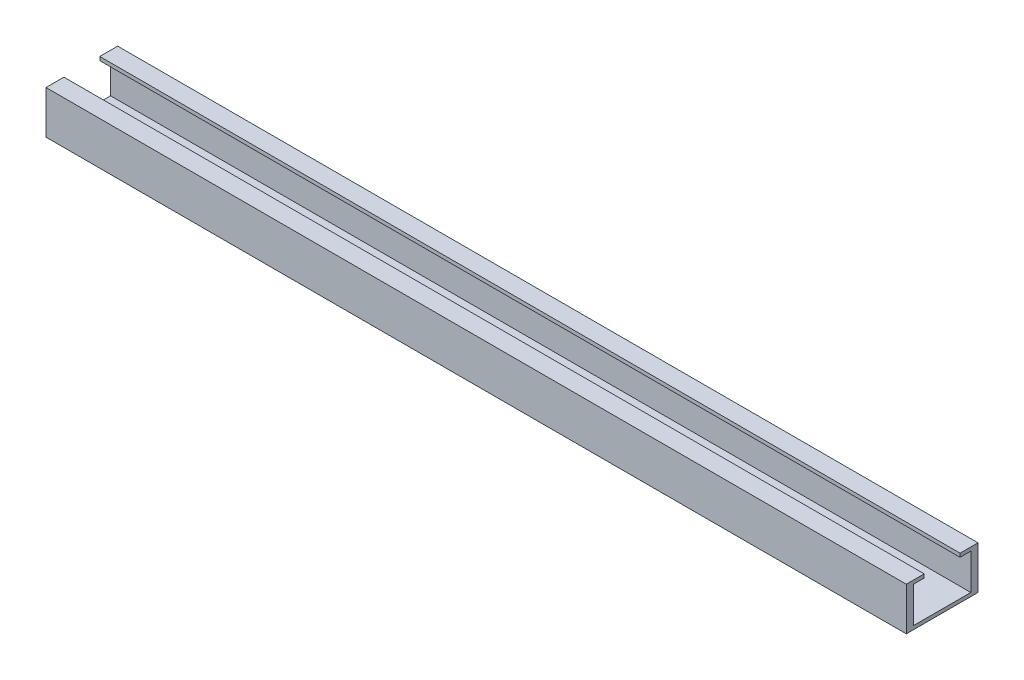
ISO-10303-21;
HEADER;
FILE_DESCRIPTION(('STEP AP214'),'2;1');
FILE_NAME('part.step','',(''),(''),'','','');
FILE_SCHEMA(('AUTOMOTIVE_DESIGN { 1 0 10303 214 1 1 1 1 }'));
ENDSEC;
DATA;
#1=APPLICATION_CONTEXT('core data for automotive mechanical design processes');
#2=APPLICATION_PROTOCOL_DEFINITION('international standard','automotive_design',2000,#1);
#3=PRODUCT_CONTEXT('',#1,'mechanical');
#4=PRODUCT('Part','Part','',(#3));
#5=PRODUCT_RELATED_PRODUCT_CATEGORY('part','',(#4));
#6=PRODUCT_DEFINITION_FORMATION('','',#4);
#7=PRODUCT_DEFINITION_CONTEXT('part definition',#1,'design');
#8=PRODUCT_DEFINITION('design','',#6,#7);
#9=PRODUCT_DEFINITION_SHAPE('','',#8);
#10=(LENGTH_UNIT() NAMED_UNIT(*) SI_UNIT(.MILLI.,.METRE.));
#11=(NAMED_UNIT(*) PLANE_ANGLE_UNIT() SI_UNIT($,.RADIAN.));
#12=(NAMED_UNIT(*) SI_UNIT($,.STERADIAN.) SOLID_ANGLE_UNIT());
#13=UNCERTAINTY_MEASURE_WITH_UNIT(LENGTH_MEASURE(1.E-05),#10,'distance_accuracy_value','');
#14=(GEOMETRIC_REPRESENTATION_CONTEXT(3) GLOBAL_UNCERTAINTY_ASSIGNED_CONTEXT((#13)) GLOBAL_UNIT_ASSIGNED_CONTEXT((#10,
#11,#12)) REPRESENTATION_CONTEXT('',''));
#15=CARTESIAN_POINT('',(0.,0.,0.));
#16=DIRECTION('',(0.,0.,1.));
#17=DIRECTION('',(1.,0.,0.));
#18=AXIS2_PLACEMENT_3D('',#15,#16,#17);
#19=CARTESIAN_POINT('',(0.,30.,0.));
#20=DIRECTION('',(0.,1.,0.));
#21=DIRECTION('',(0.,0.,1.));
#22=AXIS2_PLACEMENT_3D('',#19,#20,#21);
#23=PLANE('',#22);
#24=DIRECTION('',(-1.,0.,0.));
#25=VECTOR('',#24,1.);
#26=CARTESIAN_POINT('',(-279.522862823062,30.,-19.9055666003976));
#27=LINE('',#26,#25);
#28=CARTESIAN_POINT('',(320.477137176938,30.,-19.9055666003976));
#29=VERTEX_POINT('',#28);
#30=CARTESIAN_POINT('',(-279.522862823062,30.,-19.9055666003976));
#31=VERTEX_POINT('',#30);
#32=EDGE_CURVE('E128',#29,#31,#27,.T.);
#33=ORIENTED_EDGE('',*,*,#32,.F.);
#34=DIRECTION('',(0.,0.,-1.));
#35=VECTOR('',#34,1.);
#36=CARTESIAN_POINT('',(320.477137176938,30.,-32.4055666003976));
#37=LINE('',#36,#35);
#38=CARTESIAN_POINT('',(320.477137176938,30.,-32.4055666003976));
#39=VERTEX_POINT('',#38);
#40=EDGE_CURVE('E155',#29,#39,#37,.T.);
#41=ORIENTED_EDGE('',*,*,#40,.T.);
#42=DIRECTION('',(-1.,0.,0.));
#43=VECTOR('',#42,1.);
#44=CARTESIAN_POINT('',(-279.522862823062,30.,-32.4055666003976));
#45=LINE('',#44,#43);
#46=CARTESIAN_POINT('',(-279.522862823062,30.,-32.4055666003976));
#47=VERTEX_POINT('',#46);
#48=EDGE_CURVE('E157',#39,#47,#45,.T.);
#49=ORIENTED_EDGE('',*,*,#48,.T.);
#50=DIRECTION('',(0.,0.,1.));
#51=VECTOR('',#50,1.);
#52=CARTESIAN_POINT('',(-279.522862823062,30.,-32.4055666003976));
#53=LINE('',#52,#51);
#54=EDGE_CURVE('E143',#47,#31,#53,.T.);
#55=ORIENTED_EDGE('',*,*,#54,.T.);
#56=EDGE_LOOP('',(#33,#41,#49,#55));
#57=FACE_BOUND('',#56,.T.);
#58=ADVANCED_FACE('F34',(#57),#23,.T.);
#59=CARTESIAN_POINT('',(320.477137176938,27.5,-27.4055666003976));
#60=DIRECTION('',(0.,1.,0.));
#61=DIRECTION('',(0.,0.,1.));
#62=AXIS2_PLACEMENT_3D('',#59,#60,#61);
#63=PLANE('',#62);
#64=DIRECTION('',(0.,0.,-1.));
#65=VECTOR('',#64,1.);
#66=CARTESIAN_POINT('',(320.477137176938,27.5,-27.4055666003976));
#67=LINE('',#66,#65);
#68=CARTESIAN_POINT('',(320.477137176938,27.5,-19.9055666003976));
#69=VERTEX_POINT('',#68);
#70=CARTESIAN_POINT('',(320.477137176938,27.5,-27.4055666003976));
#71=VERTEX_POINT('',#70);
#72=EDGE_CURVE('E186',#69,#71,#67,.T.);
#73=ORIENTED_EDGE('',*,*,#72,.F.);
#74=DIRECTION('',(-1.,0.,0.));
#75=VECTOR('',#74,1.);
#76=CARTESIAN_POINT('',(320.477137176938,27.5,-19.9055666003976));
#77=LINE('',#76,#75);
#78=CARTESIAN_POINT('',(-279.522862823062,27.5,-19.9055666003976));
#79=VERTEX_POINT('',#78);
#80=EDGE_CURVE('E11',#69,#79,#77,.T.);
#81=ORIENTED_EDGE('',*,*,#80,.T.);
#82=DIRECTION('',(0.,0.,-1.));
#83=VECTOR('',#82,1.);
#84=CARTESIAN_POINT('',(-279.522862823062,27.5,-27.4055666003976));
#85=LINE('',#84,#83);
#86=CARTESIAN_POINT('',(-279.522862823062,27.5,-27.4055666003976));
#87=VERTEX_POINT('',#86);
#88=EDGE_CURVE('E201',#79,#87,#85,.T.);
#89=ORIENTED_EDGE('',*,*,#88,.T.);
#90=DIRECTION('',(-1.,0.,0.));
#91=VECTOR('',#90,1.);
#92=CARTESIAN_POINT('',(320.477137176938,27.5,-27.4055666003976));
#93=LINE('',#92,#91);
#94=EDGE_CURVE('E163',#71,#87,#93,.T.);
#95=ORIENTED_EDGE('',*,*,#94,.F.);
#96=EDGE_LOOP('',(#73,#81,#89,#95));
#97=FACE_BOUND('',#96,.T.);
#98=ADVANCED_FACE('F223',(#97),#63,.F.);
#99=CARTESIAN_POINT('',(-279.522862823062,30.,-32.4055666003976));
#100=DIRECTION('',(1.,0.,0.));
#101=DIRECTION('',(0.,0.,-1.));
#102=AXIS2_PLACEMENT_3D('',#99,#100,#101);
#103=PLANE('',#102);
#104=ORIENTED_EDGE('',*,*,#88,.F.);
#105=DIRECTION('',(0.,1.,0.));
#106=VECTOR('',#105,1.);
#107=CARTESIAN_POINT('',(-279.522862823062,10.,-19.9055666003976));
#108=LINE('',#107,#106);
#109=EDGE_CURVE('E57',#79,#31,#108,.T.);
#110=ORIENTED_EDGE('',*,*,#109,.T.);
#111=ORIENTED_EDGE('',*,*,#54,.F.);
#112=DIRECTION('',(0.,-1.,0.));
#113=VECTOR('',#112,1.);
#114=CARTESIAN_POINT('',(-279.522862823062,30.,-32.4055666003976));
#115=LINE('',#114,#113);
#116=CARTESIAN_POINT('',(-279.522862823062,0.,-32.4055666003976));
#117=VERTEX_POINT('',#116);
#118=EDGE_CURVE('E159',#47,#117,#115,.T.);
#119=ORIENTED_EDGE('',*,*,#118,.T.);
#120=DIRECTION('',(0.,0.,1.));
#121=VECTOR('',#120,1.);
#122=CARTESIAN_POINT('',(-279.522862823062,0.,-32.4055666003976));
#123=LINE('',#122,#121);
#124=CARTESIAN_POINT('',(-279.522862823062,0.,17.5944333996024));
#125=VERTEX_POINT('',#124);
#126=EDGE_CURVE('E160',#117,#125,#123,.T.);
#127=ORIENTED_EDGE('',*,*,#126,.T.);
#128=DIRECTION('',(0.,-1.,0.));
#129=VECTOR('',#128,1.);
#130=CARTESIAN_POINT('',(-279.522862823062,30.,17.5944333996024));
#131=LINE('',#130,#129);
#132=CARTESIAN_POINT('',(-279.522862823062,30.,17.5944333996024));
#133=VERTEX_POINT('',#132);
#134=EDGE_CURVE('E142',#133,#125,#131,.T.);
#135=ORIENTED_EDGE('',*,*,#134,.F.);
#136=CARTESIAN_POINT('',(-279.522862823062,30.,5.09443339960241));
#137=VERTEX_POINT('',#136);
#138=EDGE_CURVE('E133',#137,#133,#53,.T.);
#139=ORIENTED_EDGE('',*,*,#138,.F.);
#140=DIRECTION('',(0.,1.,0.));
#141=VECTOR('',#140,1.);
#142=CARTESIAN_POINT('',(-279.522862823062,10.,5.09443339960241));
#143=LINE('',#142,#141);
#144=CARTESIAN_POINT('',(-279.522862823062,27.5,5.09443339960241));
#145=VERTEX_POINT('',#144);
#146=EDGE_CURVE('E120',#145,#137,#143,.T.);
#147=ORIENTED_EDGE('',*,*,#146,.F.);
#148=CARTESIAN_POINT('',(-279.522862823062,27.5,12.5944333996024));
#149=VERTEX_POINT('',#148);
#150=EDGE_CURVE('E180',#149,#145,#85,.T.);
#151=ORIENTED_EDGE('',*,*,#150,.F.);
#152=DIRECTION('',(0.,1.,0.));
#153=VECTOR('',#152,1.);
#154=CARTESIAN_POINT('',(-279.522862823062,27.5,12.5944333996024));
#155=LINE('',#154,#153);
#156=CARTESIAN_POINT('',(-279.522862823062,2.5,12.5944333996024));
#157=VERTEX_POINT('',#156);
#158=EDGE_CURVE('E198',#157,#149,#155,.T.);
#159=ORIENTED_EDGE('',*,*,#158,.F.);
#160=DIRECTION('',(0.,0.,1.));
#161=VECTOR('',#160,1.);
#162=CARTESIAN_POINT('',(-279.522862823062,2.5,-27.4055666003976));
#163=LINE('',#162,#161);
#164=CARTESIAN_POINT('',(-279.522862823062,2.5,-27.4055666003976));
#165=VERTEX_POINT('',#164);
#166=EDGE_CURVE('E195',#165,#157,#163,.T.);
#167=ORIENTED_EDGE('',*,*,#166,.F.);
#168=DIRECTION('',(0.,-1.,0.));
#169=VECTOR('',#168,1.);
#170=CARTESIAN_POINT('',(-279.522862823062,27.5,-27.4055666003976));
#171=LINE('',#170,#169);
#172=EDGE_CURVE('E193',#87,#165,#171,.T.);
#173=ORIENTED_EDGE('',*,*,#172,.F.);
#174=EDGE_LOOP('',(#104,#110,#111,#119,#127,#135,#139,#147,#151,#159,#167,#173));
#175=FACE_BOUND('',#174,.T.);
#176=ADVANCED_FACE('F36',(#175),#103,.F.);
#177=CARTESIAN_POINT('',(-279.522862823062,30.,17.5944333996024));
#178=DIRECTION('',(0.,0.,-1.));
#179=DIRECTION('',(-1.,0.,0.));
#180=AXIS2_PLACEMENT_3D('',#177,#178,#179);
#181=PLANE('',#180);
#182=DIRECTION('',(1.,0.,0.));
#183=VECTOR('',#182,1.);
#184=CARTESIAN_POINT('',(-279.522862823062,0.,17.5944333996024));
#185=LINE('',#184,#183);
#186=CARTESIAN_POINT('',(320.477137176938,0.,17.5944333996024));
#187=VERTEX_POINT('',#186);
#188=EDGE_CURVE('E162',#125,#187,#185,.T.);
#189=ORIENTED_EDGE('',*,*,#188,.T.);
#190=DIRECTION('',(0.,-1.,0.));
#191=VECTOR('',#190,1.);
#192=CARTESIAN_POINT('',(320.477137176938,30.,17.5944333996024));
#193=LINE('',#192,#191);
#194=CARTESIAN_POINT('',(320.477137176938,30.,17.5944333996024));
#195=VERTEX_POINT('',#194);
#196=EDGE_CURVE('E171',#195,#187,#193,.T.);
#197=ORIENTED_EDGE('',*,*,#196,.F.);
#198=DIRECTION('',(1.,0.,0.));
#199=VECTOR('',#198,1.);
#200=CARTESIAN_POINT('',(-279.522862823062,30.,17.5944333996024));
#201=LINE('',#200,#199);
#202=EDGE_CURVE('E147',#133,#195,#201,.T.);
#203=ORIENTED_EDGE('',*,*,#202,.F.);
#204=ORIENTED_EDGE('',*,*,#134,.T.);
#205=EDGE_LOOP('',(#189,#197,#203,#204));
#206=FACE_BOUND('',#205,.T.);
#207=ADVANCED_FACE('F248',(#206),#181,.F.);
#208=CARTESIAN_POINT('',(320.477137176938,30.,-32.4055666003976));
#209=DIRECTION('',(-1.,0.,0.));
#210=DIRECTION('',(0.,0.,1.));
#211=AXIS2_PLACEMENT_3D('',#208,#209,#210);
#212=PLANE('',#211);
#213=ORIENTED_EDGE('',*,*,#40,.F.);
#214=DIRECTION('',(0.,1.,0.));
#215=VECTOR('',#214,1.);
#216=CARTESIAN_POINT('',(320.477137176938,10.,-19.9055666003976));
#217=LINE('',#216,#215);
#218=EDGE_CURVE('E226',#69,#29,#217,.T.);
#219=ORIENTED_EDGE('',*,*,#218,.F.);
#220=ORIENTED_EDGE('',*,*,#72,.T.);
#221=DIRECTION('',(0.,-1.,0.));
#222=VECTOR('',#221,1.);
#223=CARTESIAN_POINT('',(320.477137176938,27.5,-27.4055666003976));
#224=LINE('',#223,#222);
#225=CARTESIAN_POINT('',(320.477137176938,2.5,-27.4055666003976));
#226=VERTEX_POINT('',#225);
#227=EDGE_CURVE('E203',#71,#226,#224,.T.);
#228=ORIENTED_EDGE('',*,*,#227,.T.);
#229=DIRECTION('',(0.,0.,1.));
#230=VECTOR('',#229,1.);
#231=CARTESIAN_POINT('',(320.477137176938,2.5,-27.4055666003976));
#232=LINE('',#231,#230);
#233=CARTESIAN_POINT('',(320.477137176938,2.5,12.5944333996024));
#234=VERTEX_POINT('',#233);
#235=EDGE_CURVE('E234',#226,#234,#232,.T.);
#236=ORIENTED_EDGE('',*,*,#235,.T.);
#237=DIRECTION('',(0.,1.,0.));
#238=VECTOR('',#237,1.);
#239=CARTESIAN_POINT('',(320.477137176938,27.5,12.5944333996024));
#240=LINE('',#239,#238);
#241=CARTESIAN_POINT('',(320.477137176938,27.5,12.5944333996024));
#242=VERTEX_POINT('',#241);
#243=EDGE_CURVE('E185',#234,#242,#240,.T.);
#244=ORIENTED_EDGE('',*,*,#243,.T.);
#245=CARTESIAN_POINT('',(320.477137176938,27.5,5.09443339960241));
#246=VERTEX_POINT('',#245);
#247=EDGE_CURVE('E178',#242,#246,#67,.T.);
#248=ORIENTED_EDGE('',*,*,#247,.T.);
#249=DIRECTION('',(0.,1.,0.));
#250=VECTOR('',#249,1.);
#251=CARTESIAN_POINT('',(320.477137176938,10.,5.09443339960241));
#252=LINE('',#251,#250);
#253=CARTESIAN_POINT('',(320.477137176938,30.,5.09443339960241));
#254=VERTEX_POINT('',#253);
#255=EDGE_CURVE('E49',#246,#254,#252,.T.);
#256=ORIENTED_EDGE('',*,*,#255,.T.);
#257=EDGE_CURVE('E136',#195,#254,#37,.T.);
#258=ORIENTED_EDGE('',*,*,#257,.F.);
#259=ORIENTED_EDGE('',*,*,#196,.T.);
#260=DIRECTION('',(0.,0.,-1.));
#261=VECTOR('',#260,1.);
#262=CARTESIAN_POINT('',(320.477137176938,0.,-32.4055666003976));
#263=LINE('',#262,#261);
#264=CARTESIAN_POINT('',(320.477137176938,0.,-32.4055666003976));
#265=VERTEX_POINT('',#264);
#266=EDGE_CURVE('E148',#187,#265,#263,.T.);
#267=ORIENTED_EDGE('',*,*,#266,.T.);
#268=DIRECTION('',(0.,-1.,0.));
#269=VECTOR('',#268,1.);
#270=CARTESIAN_POINT('',(320.477137176938,30.,-32.4055666003976));
#271=LINE('',#270,#269);
#272=EDGE_CURVE('E168',#39,#265,#271,.T.);
#273=ORIENTED_EDGE('',*,*,#272,.F.);
#274=EDGE_LOOP('',(#213,#219,#220,#228,#236,#244,#248,#256,#258,#259,#267,#273));
#275=FACE_BOUND('',#274,.T.);
#276=ADVANCED_FACE('F183',(#275),#212,.F.);
#277=CARTESIAN_POINT('',(-279.522862823062,30.,-32.4055666003976));
#278=DIRECTION('',(0.,0.,1.));
#279=DIRECTION('',(1.,0.,0.));
#280=AXIS2_PLACEMENT_3D('',#277,#278,#279);
#281=PLANE('',#280);
#282=DIRECTION('',(-1.,0.,0.));
#283=VECTOR('',#282,1.);
#284=CARTESIAN_POINT('',(-279.522862823062,0.,-32.4055666003976));
#285=LINE('',#284,#283);
#286=EDGE_CURVE('E144',#265,#117,#285,.T.);
#287=ORIENTED_EDGE('',*,*,#286,.T.);
#288=ORIENTED_EDGE('',*,*,#118,.F.);
#289=ORIENTED_EDGE('',*,*,#48,.F.);
#290=ORIENTED_EDGE('',*,*,#272,.T.);
#291=EDGE_LOOP('',(#287,#288,#289,#290));
#292=FACE_BOUND('',#291,.T.);
#293=ADVANCED_FACE('F240',(#292),#281,.F.);
#294=DIRECTION('',(1.,0.,0.));
#295=VECTOR('',#294,1.);
#296=CARTESIAN_POINT('',(-279.522862823062,30.,5.09443339960241));
#297=LINE('',#296,#295);
#298=EDGE_CURVE('E123',#137,#254,#297,.T.);
#299=ORIENTED_EDGE('',*,*,#298,.F.);
#300=ORIENTED_EDGE('',*,*,#138,.T.);
#301=ORIENTED_EDGE('',*,*,#202,.T.);
#302=ORIENTED_EDGE('',*,*,#257,.T.);
#303=EDGE_LOOP('',(#299,#300,#301,#302));
#304=FACE_BOUND('',#303,.T.);
#305=ADVANCED_FACE('F132',(#304),#23,.T.);
#306=CARTESIAN_POINT('',(0.,0.,0.));
#307=DIRECTION('',(0.,1.,0.));
#308=DIRECTION('',(0.,0.,1.));
#309=AXIS2_PLACEMENT_3D('',#306,#307,#308);
#310=PLANE('',#309);
#311=ORIENTED_EDGE('',*,*,#126,.F.);
#312=ORIENTED_EDGE('',*,*,#286,.F.);
#313=ORIENTED_EDGE('',*,*,#266,.F.);
#314=ORIENTED_EDGE('',*,*,#188,.F.);
#315=EDGE_LOOP('',(#311,#312,#313,#314));
#316=FACE_BOUND('',#315,.T.);
#317=ADVANCED_FACE('F244',(#316),#310,.F.);
#318=CARTESIAN_POINT('',(320.477137176938,27.5,-27.4055666003976));
#319=DIRECTION('',(0.,0.,-1.));
#320=DIRECTION('',(0.,1.,0.));
#321=AXIS2_PLACEMENT_3D('',#318,#319,#320);
#322=PLANE('',#321);
#323=ORIENTED_EDGE('',*,*,#172,.T.);
#324=DIRECTION('',(-1.,0.,0.));
#325=VECTOR('',#324,1.);
#326=CARTESIAN_POINT('',(320.477137176938,2.5,-27.4055666003976));
#327=LINE('',#326,#325);
#328=EDGE_CURVE('E152',#226,#165,#327,.T.);
#329=ORIENTED_EDGE('',*,*,#328,.F.);
#330=ORIENTED_EDGE('',*,*,#227,.F.);
#331=ORIENTED_EDGE('',*,*,#94,.T.);
#332=EDGE_LOOP('',(#323,#329,#330,#331));
#333=FACE_BOUND('',#332,.T.);
#334=ADVANCED_FACE('F217',(#333),#322,.F.);
#335=ORIENTED_EDGE('',*,*,#150,.T.);
#336=DIRECTION('',(1.,0.,0.));
#337=VECTOR('',#336,1.);
#338=CARTESIAN_POINT('',(320.477137176938,27.5,5.09443339960241));
#339=LINE('',#338,#337);
#340=EDGE_CURVE('E42',#145,#246,#339,.T.);
#341=ORIENTED_EDGE('',*,*,#340,.T.);
#342=ORIENTED_EDGE('',*,*,#247,.F.);
#343=DIRECTION('',(-1.,0.,0.));
#344=VECTOR('',#343,1.);
#345=CARTESIAN_POINT('',(320.477137176938,27.5,12.5944333996024));
#346=LINE('',#345,#344);
#347=EDGE_CURVE('E206',#242,#149,#346,.T.);
#348=ORIENTED_EDGE('',*,*,#347,.T.);
#349=EDGE_LOOP('',(#335,#341,#342,#348));
#350=FACE_BOUND('',#349,.T.);
#351=ADVANCED_FACE('F177',(#350),#63,.F.);
#352=CARTESIAN_POINT('',(320.477137176938,27.5,12.5944333996024));
#353=DIRECTION('',(0.,0.,1.));
#354=DIRECTION('',(1.,0.,0.));
#355=AXIS2_PLACEMENT_3D('',#352,#353,#354);
#356=PLANE('',#355);
#357=ORIENTED_EDGE('',*,*,#158,.T.);
#358=ORIENTED_EDGE('',*,*,#347,.F.);
#359=ORIENTED_EDGE('',*,*,#243,.F.);
#360=DIRECTION('',(-1.,0.,0.));
#361=VECTOR('',#360,1.);
#362=CARTESIAN_POINT('',(320.477137176938,2.5,12.5944333996024));
#363=LINE('',#362,#361);
#364=EDGE_CURVE('E189',#234,#157,#363,.T.);
#365=ORIENTED_EDGE('',*,*,#364,.T.);
#366=EDGE_LOOP('',(#357,#358,#359,#365));
#367=FACE_BOUND('',#366,.T.);
#368=ADVANCED_FACE('F209',(#367),#356,.F.);
#369=CARTESIAN_POINT('',(320.477137176938,2.5,-27.4055666003976));
#370=DIRECTION('',(0.,-1.,0.));
#371=DIRECTION('',(0.,0.,-1.));
#372=AXIS2_PLACEMENT_3D('',#369,#370,#371);
#373=PLANE('',#372);
#374=ORIENTED_EDGE('',*,*,#166,.T.);
#375=ORIENTED_EDGE('',*,*,#364,.F.);
#376=ORIENTED_EDGE('',*,*,#235,.F.);
#377=ORIENTED_EDGE('',*,*,#328,.T.);
#378=EDGE_LOOP('',(#374,#375,#376,#377));
#379=FACE_BOUND('',#378,.T.);
#380=ADVANCED_FACE('F214',(#379),#373,.F.);
#381=CARTESIAN_POINT('',(-279.522862823062,10.,5.09443339960241));
#382=DIRECTION('',(0.,0.,1.));
#383=DIRECTION('',(1.,0.,0.));
#384=AXIS2_PLACEMENT_3D('',#381,#382,#383);
#385=PLANE('',#384);
#386=ORIENTED_EDGE('',*,*,#146,.T.);
#387=ORIENTED_EDGE('',*,*,#298,.T.);
#388=ORIENTED_EDGE('',*,*,#255,.F.);
#389=ORIENTED_EDGE('',*,*,#340,.F.);
#390=EDGE_LOOP('',(#386,#387,#388,#389));
#391=FACE_BOUND('',#390,.T.);
#392=ADVANCED_FACE('F122',(#391),#385,.F.);
#393=CARTESIAN_POINT('',(-279.522862823062,10.,-19.9055666003976));
#394=DIRECTION('',(0.,0.,-1.));
#395=DIRECTION('',(-1.,0.,0.));
#396=AXIS2_PLACEMENT_3D('',#393,#394,#395);
#397=PLANE('',#396);
#398=ORIENTED_EDGE('',*,*,#218,.T.);
#399=ORIENTED_EDGE('',*,*,#32,.T.);
#400=ORIENTED_EDGE('',*,*,#109,.F.);
#401=ORIENTED_EDGE('',*,*,#80,.F.);
#402=EDGE_LOOP('',(#398,#399,#400,#401));
#403=FACE_BOUND('',#402,.T.);
#404=ADVANCED_FACE('F225',(#403),#397,.F.);
#405=CLOSED_SHELL('',(#58,#98,#176,#207,#276,#293,#305,#317,#334,#351,#368,#380,#392,#404));
#406=MANIFOLD_SOLID_BREP('B2',#405);
#407=ADVANCED_BREP_SHAPE_REPRESENTATION('',(#18,#406),#14);
#408=SHAPE_DEFINITION_REPRESENTATION(#9,#407);
ENDSEC;
END-ISO-10303-21;
